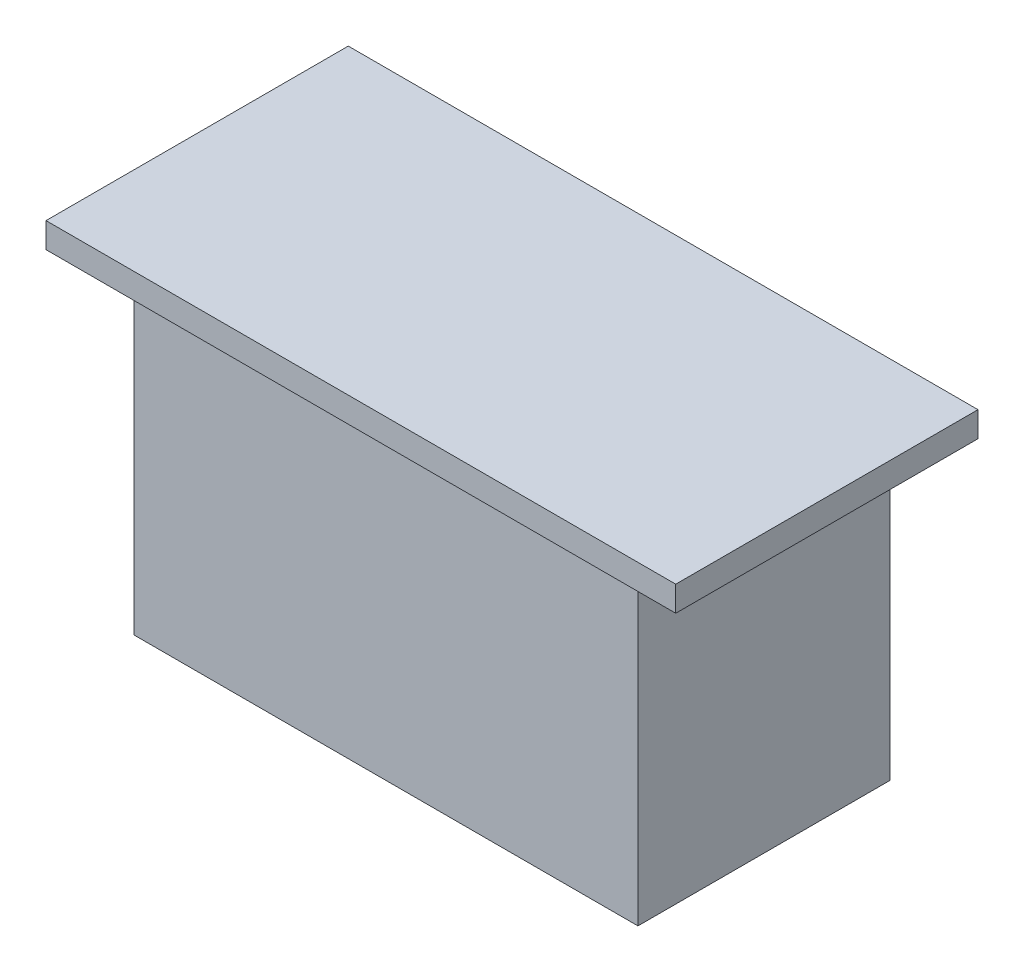
ISO-10303-21;
HEADER;
FILE_DESCRIPTION(('STEP AP214'),'2;1');
FILE_NAME('part.step','',(''),(''),'','','');
FILE_SCHEMA(('AUTOMOTIVE_DESIGN { 1 0 10303 214 1 1 1 1 }'));
ENDSEC;
DATA;
#1=APPLICATION_CONTEXT('core data for automotive mechanical design processes');
#2=APPLICATION_PROTOCOL_DEFINITION('international standard','automotive_design',2000,#1);
#3=PRODUCT_CONTEXT('',#1,'mechanical');
#4=PRODUCT('Part','Part','',(#3));
#5=PRODUCT_RELATED_PRODUCT_CATEGORY('part','',(#4));
#6=PRODUCT_DEFINITION_FORMATION('','',#4);
#7=PRODUCT_DEFINITION_CONTEXT('part definition',#1,'design');
#8=PRODUCT_DEFINITION('design','',#6,#7);
#9=PRODUCT_DEFINITION_SHAPE('','',#8);
#10=(LENGTH_UNIT() NAMED_UNIT(*) SI_UNIT(.MILLI.,.METRE.));
#11=(NAMED_UNIT(*) PLANE_ANGLE_UNIT() SI_UNIT($,.RADIAN.));
#12=(NAMED_UNIT(*) SI_UNIT($,.STERADIAN.) SOLID_ANGLE_UNIT());
#13=UNCERTAINTY_MEASURE_WITH_UNIT(LENGTH_MEASURE(1.E-05),#10,'distance_accuracy_value','');
#14=(GEOMETRIC_REPRESENTATION_CONTEXT(3) GLOBAL_UNCERTAINTY_ASSIGNED_CONTEXT((#13)) GLOBAL_UNIT_ASSIGNED_CONTEXT((#10,
#11,#12)) REPRESENTATION_CONTEXT('',''));
#15=CARTESIAN_POINT('',(0.,0.,0.));
#16=DIRECTION('',(0.,0.,1.));
#17=DIRECTION('',(1.,0.,0.));
#18=AXIS2_PLACEMENT_3D('',#15,#16,#17);
#19=CARTESIAN_POINT('',(-9.81854133457408,15.875,-5.98265060114626));
#20=DIRECTION('',(0.,0.,-1.));
#21=DIRECTION('',(-1.,0.,0.));
#22=AXIS2_PLACEMENT_3D('',#19,#20,#21);
#23=PLANE('',#22);
#24=DIRECTION('',(1.,0.,0.));
#25=VECTOR('',#24,1.);
#26=CARTESIAN_POINT('',(-9.81854133457408,0.,-5.98265060114626));
#27=LINE('',#26,#25);
#28=CARTESIAN_POINT('',(-9.81854133457408,0.,-5.98265060114626));
#29=VERTEX_POINT('',#28);
#30=CARTESIAN_POINT('',(15.5814586654259,0.,-5.98265060114626));
#31=VERTEX_POINT('',#30);
#32=EDGE_CURVE('E89',#29,#31,#27,.T.);
#33=ORIENTED_EDGE('',*,*,#32,.F.);
#34=DIRECTION('',(0.,-1.,0.));
#35=VECTOR('',#34,1.);
#36=CARTESIAN_POINT('',(-9.81854133457408,15.875,-5.98265060114626));
#37=LINE('',#36,#35);
#38=CARTESIAN_POINT('',(-9.81854133457408,15.875,-5.98265060114626));
#39=VERTEX_POINT('',#38);
#40=EDGE_CURVE('E11',#39,#29,#37,.T.);
#41=ORIENTED_EDGE('',*,*,#40,.F.);
#42=DIRECTION('',(1.,0.,0.));
#43=VECTOR('',#42,1.);
#44=CARTESIAN_POINT('',(-9.81854133457408,15.875,-5.98265060114626));
#45=LINE('',#44,#43);
#46=CARTESIAN_POINT('',(15.5814586654259,15.875,-5.98265060114626));
#47=VERTEX_POINT('',#46);
#48=EDGE_CURVE('E76',#39,#47,#45,.T.);
#49=ORIENTED_EDGE('',*,*,#48,.T.);
#50=DIRECTION('',(0.,-1.,0.));
#51=VECTOR('',#50,1.);
#52=CARTESIAN_POINT('',(15.5814586654259,15.875,-5.98265060114626));
#53=LINE('',#52,#51);
#54=EDGE_CURVE('E36',#47,#31,#53,.T.);
#55=ORIENTED_EDGE('',*,*,#54,.T.);
#56=EDGE_LOOP('',(#33,#41,#49,#55));
#57=FACE_BOUND('',#56,.T.);
#58=ADVANCED_FACE('F33',(#57),#23,.T.);
#59=CARTESIAN_POINT('',(-9.81854133457408,15.875,-5.98265060114626));
#60=DIRECTION('',(1.,0.,0.));
#61=DIRECTION('',(0.,0.,-1.));
#62=AXIS2_PLACEMENT_3D('',#59,#60,#61);
#63=PLANE('',#62);
#64=DIRECTION('',(0.,0.,1.));
#65=VECTOR('',#64,1.);
#66=CARTESIAN_POINT('',(-9.81854133457408,0.,-5.98265060114626));
#67=LINE('',#66,#65);
#68=CARTESIAN_POINT('',(-9.81854133457408,0.,6.71734939885374));
#69=VERTEX_POINT('',#68);
#70=EDGE_CURVE('E66',#29,#69,#67,.T.);
#71=ORIENTED_EDGE('',*,*,#70,.T.);
#72=DIRECTION('',(0.,-1.,0.));
#73=VECTOR('',#72,1.);
#74=CARTESIAN_POINT('',(-9.81854133457408,15.875,6.71734939885374));
#75=LINE('',#74,#73);
#76=CARTESIAN_POINT('',(-9.81854133457408,15.875,6.71734939885374));
#77=VERTEX_POINT('',#76);
#78=EDGE_CURVE('E42',#77,#69,#75,.T.);
#79=ORIENTED_EDGE('',*,*,#78,.F.);
#80=DIRECTION('',(0.,0.,1.));
#81=VECTOR('',#80,1.);
#82=CARTESIAN_POINT('',(-9.81854133457408,15.875,-5.98265060114626));
#83=LINE('',#82,#81);
#84=EDGE_CURVE('E94',#39,#77,#83,.T.);
#85=ORIENTED_EDGE('',*,*,#84,.F.);
#86=ORIENTED_EDGE('',*,*,#40,.T.);
#87=EDGE_LOOP('',(#71,#79,#85,#86));
#88=FACE_BOUND('',#87,.T.);
#89=ADVANCED_FACE('F68',(#88),#63,.F.);
#90=CARTESIAN_POINT('',(-9.81854133457408,15.875,6.71734939885374));
#91=DIRECTION('',(0.,0.,-1.));
#92=DIRECTION('',(-1.,0.,0.));
#93=AXIS2_PLACEMENT_3D('',#90,#91,#92);
#94=PLANE('',#93);
#95=DIRECTION('',(1.,0.,0.));
#96=VECTOR('',#95,1.);
#97=CARTESIAN_POINT('',(-9.81854133457408,0.,6.71734939885374));
#98=LINE('',#97,#96);
#99=CARTESIAN_POINT('',(15.5814586654259,0.,6.71734939885374));
#100=VERTEX_POINT('',#99);
#101=EDGE_CURVE('E77',#69,#100,#98,.T.);
#102=ORIENTED_EDGE('',*,*,#101,.T.);
#103=DIRECTION('',(0.,-1.,0.));
#104=VECTOR('',#103,1.);
#105=CARTESIAN_POINT('',(15.5814586654259,15.875,6.71734939885374));
#106=LINE('',#105,#104);
#107=CARTESIAN_POINT('',(15.5814586654259,15.875,6.71734939885374));
#108=VERTEX_POINT('',#107);
#109=EDGE_CURVE('E83',#108,#100,#106,.T.);
#110=ORIENTED_EDGE('',*,*,#109,.F.);
#111=DIRECTION('',(1.,0.,0.));
#112=VECTOR('',#111,1.);
#113=CARTESIAN_POINT('',(-9.81854133457408,15.875,6.71734939885374));
#114=LINE('',#113,#112);
#115=EDGE_CURVE('E50',#77,#108,#114,.T.);
#116=ORIENTED_EDGE('',*,*,#115,.F.);
#117=ORIENTED_EDGE('',*,*,#78,.T.);
#118=EDGE_LOOP('',(#102,#110,#116,#117));
#119=FACE_BOUND('',#118,.T.);
#120=ADVANCED_FACE('F81',(#119),#94,.F.);
#121=CARTESIAN_POINT('',(15.5814586654259,15.875,-5.98265060114626));
#122=DIRECTION('',(1.,0.,0.));
#123=DIRECTION('',(0.,0.,-1.));
#124=AXIS2_PLACEMENT_3D('',#121,#122,#123);
#125=PLANE('',#124);
#126=DIRECTION('',(0.,0.,1.));
#127=VECTOR('',#126,1.);
#128=CARTESIAN_POINT('',(15.5814586654259,0.,-5.98265060114626));
#129=LINE('',#128,#127);
#130=EDGE_CURVE('E87',#31,#100,#129,.T.);
#131=ORIENTED_EDGE('',*,*,#130,.F.);
#132=ORIENTED_EDGE('',*,*,#54,.F.);
#133=DIRECTION('',(0.,0.,1.));
#134=VECTOR('',#133,1.);
#135=CARTESIAN_POINT('',(15.5814586654259,15.875,-5.98265060114626));
#136=LINE('',#135,#134);
#137=EDGE_CURVE('E100',#47,#108,#136,.T.);
#138=ORIENTED_EDGE('',*,*,#137,.T.);
#139=ORIENTED_EDGE('',*,*,#109,.T.);
#140=EDGE_LOOP('',(#131,#132,#138,#139));
#141=FACE_BOUND('',#140,.T.);
#142=ADVANCED_FACE('F118',(#141),#125,.T.);
#143=CARTESIAN_POINT('',(0.,0.,0.));
#144=DIRECTION('',(0.,-1.,0.));
#145=DIRECTION('',(0.,0.,-1.));
#146=AXIS2_PLACEMENT_3D('',#143,#144,#145);
#147=PLANE('',#146);
#148=ORIENTED_EDGE('',*,*,#32,.T.);
#149=ORIENTED_EDGE('',*,*,#130,.T.);
#150=ORIENTED_EDGE('',*,*,#101,.F.);
#151=ORIENTED_EDGE('',*,*,#70,.F.);
#152=EDGE_LOOP('',(#148,#149,#150,#151));
#153=FACE_BOUND('',#152,.T.);
#154=ADVANCED_FACE('F85',(#153),#147,.T.);
#155=CARTESIAN_POINT('',(-12.9935413345741,17.145,7.98734939885374));
#156=DIRECTION('',(1.,0.,0.));
#157=DIRECTION('',(0.,0.,-1.));
#158=AXIS2_PLACEMENT_3D('',#155,#156,#157);
#159=PLANE('',#158);
#160=DIRECTION('',(0.,0.,1.));
#161=VECTOR('',#160,1.);
#162=CARTESIAN_POINT('',(-12.9935413345741,15.875,7.98734939885374));
#163=LINE('',#162,#161);
#164=CARTESIAN_POINT('',(-12.9935413345741,15.875,-7.25265060114625));
#165=VERTEX_POINT('',#164);
#166=CARTESIAN_POINT('',(-12.9935413345741,15.875,7.98734939885374));
#167=VERTEX_POINT('',#166);
#168=EDGE_CURVE('E164',#165,#167,#163,.T.);
#169=ORIENTED_EDGE('',*,*,#168,.T.);
#170=DIRECTION('',(0.,-1.,0.));
#171=VECTOR('',#170,1.);
#172=CARTESIAN_POINT('',(-12.9935413345741,17.145,7.98734939885374));
#173=LINE('',#172,#171);
#174=CARTESIAN_POINT('',(-12.9935413345741,17.145,7.98734939885374));
#175=VERTEX_POINT('',#174);
#176=EDGE_CURVE('E103',#175,#167,#173,.T.);
#177=ORIENTED_EDGE('',*,*,#176,.F.);
#178=DIRECTION('',(0.,0.,1.));
#179=VECTOR('',#178,1.);
#180=CARTESIAN_POINT('',(-12.9935413345741,17.145,7.98734939885374));
#181=LINE('',#180,#179);
#182=CARTESIAN_POINT('',(-12.9935413345741,17.145,-7.25265060114625));
#183=VERTEX_POINT('',#182);
#184=EDGE_CURVE('E151',#183,#175,#181,.T.);
#185=ORIENTED_EDGE('',*,*,#184,.F.);
#186=DIRECTION('',(0.,-1.,0.));
#187=VECTOR('',#186,1.);
#188=CARTESIAN_POINT('',(-12.9935413345741,17.145,-7.25265060114625));
#189=LINE('',#188,#187);
#190=EDGE_CURVE('E165',#183,#165,#189,.T.);
#191=ORIENTED_EDGE('',*,*,#190,.T.);
#192=EDGE_LOOP('',(#169,#177,#185,#191));
#193=FACE_BOUND('',#192,.T.);
#194=ADVANCED_FACE('F162',(#193),#159,.F.);
#195=CARTESIAN_POINT('',(-12.9935413345741,17.145,7.98734939885374));
#196=DIRECTION('',(0.,0.,-1.));
#197=DIRECTION('',(-1.,0.,0.));
#198=AXIS2_PLACEMENT_3D('',#195,#196,#197);
#199=PLANE('',#198);
#200=DIRECTION('',(1.,0.,0.));
#201=VECTOR('',#200,1.);
#202=CARTESIAN_POINT('',(-12.9935413345741,15.875,7.98734939885374));
#203=LINE('',#202,#201);
#204=CARTESIAN_POINT('',(18.7564586654259,15.875,7.98734939885374));
#205=VERTEX_POINT('',#204);
#206=EDGE_CURVE('E167',#167,#205,#203,.T.);
#207=ORIENTED_EDGE('',*,*,#206,.T.);
#208=DIRECTION('',(0.,-1.,0.));
#209=VECTOR('',#208,1.);
#210=CARTESIAN_POINT('',(18.7564586654259,17.145,7.98734939885374));
#211=LINE('',#210,#209);
#212=CARTESIAN_POINT('',(18.7564586654259,17.145,7.98734939885374));
#213=VERTEX_POINT('',#212);
#214=EDGE_CURVE('E105',#213,#205,#211,.T.);
#215=ORIENTED_EDGE('',*,*,#214,.F.);
#216=DIRECTION('',(1.,0.,0.));
#217=VECTOR('',#216,1.);
#218=CARTESIAN_POINT('',(-12.9935413345741,17.145,7.98734939885374));
#219=LINE('',#218,#217);
#220=EDGE_CURVE('E145',#175,#213,#219,.T.);
#221=ORIENTED_EDGE('',*,*,#220,.F.);
#222=ORIENTED_EDGE('',*,*,#176,.T.);
#223=EDGE_LOOP('',(#207,#215,#221,#222));
#224=FACE_BOUND('',#223,.T.);
#225=ADVANCED_FACE('F147',(#224),#199,.F.);
#226=CARTESIAN_POINT('',(18.7564586654259,17.145,7.98734939885374));
#227=DIRECTION('',(-1.,0.,0.));
#228=DIRECTION('',(0.,0.,1.));
#229=AXIS2_PLACEMENT_3D('',#226,#227,#228);
#230=PLANE('',#229);
#231=DIRECTION('',(0.,0.,-1.));
#232=VECTOR('',#231,1.);
#233=CARTESIAN_POINT('',(18.7564586654259,15.875,7.98734939885374));
#234=LINE('',#233,#232);
#235=CARTESIAN_POINT('',(18.7564586654259,15.875,-7.25265060114626));
#236=VERTEX_POINT('',#235);
#237=EDGE_CURVE('E169',#205,#236,#234,.T.);
#238=ORIENTED_EDGE('',*,*,#237,.T.);
#239=DIRECTION('',(0.,-1.,0.));
#240=VECTOR('',#239,1.);
#241=CARTESIAN_POINT('',(18.7564586654259,17.145,-7.25265060114626));
#242=LINE('',#241,#240);
#243=CARTESIAN_POINT('',(18.7564586654259,17.145,-7.25265060114626));
#244=VERTEX_POINT('',#243);
#245=EDGE_CURVE('E114',#244,#236,#242,.T.);
#246=ORIENTED_EDGE('',*,*,#245,.F.);
#247=DIRECTION('',(0.,0.,-1.));
#248=VECTOR('',#247,1.);
#249=CARTESIAN_POINT('',(18.7564586654259,17.145,7.98734939885374));
#250=LINE('',#249,#248);
#251=EDGE_CURVE('E150',#213,#244,#250,.T.);
#252=ORIENTED_EDGE('',*,*,#251,.F.);
#253=ORIENTED_EDGE('',*,*,#214,.T.);
#254=EDGE_LOOP('',(#238,#246,#252,#253));
#255=FACE_BOUND('',#254,.T.);
#256=ADVANCED_FACE('F182',(#255),#230,.F.);
#257=CARTESIAN_POINT('',(-12.9935413345741,17.145,-7.25265060114625));
#258=DIRECTION('',(0.,0.,1.));
#259=DIRECTION('',(1.,0.,0.));
#260=AXIS2_PLACEMENT_3D('',#257,#258,#259);
#261=PLANE('',#260);
#262=DIRECTION('',(-1.,0.,0.));
#263=VECTOR('',#262,1.);
#264=CARTESIAN_POINT('',(-12.9935413345741,15.875,-7.25265060114625));
#265=LINE('',#264,#263);
#266=EDGE_CURVE('E160',#236,#165,#265,.T.);
#267=ORIENTED_EDGE('',*,*,#266,.T.);
#268=ORIENTED_EDGE('',*,*,#190,.F.);
#269=DIRECTION('',(-1.,0.,0.));
#270=VECTOR('',#269,1.);
#271=CARTESIAN_POINT('',(-12.9935413345741,17.145,-7.25265060114625));
#272=LINE('',#271,#270);
#273=EDGE_CURVE('E156',#244,#183,#272,.T.);
#274=ORIENTED_EDGE('',*,*,#273,.F.);
#275=ORIENTED_EDGE('',*,*,#245,.T.);
#276=EDGE_LOOP('',(#267,#268,#274,#275));
#277=FACE_BOUND('',#276,.T.);
#278=ADVANCED_FACE('F179',(#277),#261,.F.);
#279=CARTESIAN_POINT('',(0.,17.145,0.));
#280=DIRECTION('',(0.,-1.,0.));
#281=DIRECTION('',(0.,0.,-1.));
#282=AXIS2_PLACEMENT_3D('',#279,#280,#281);
#283=PLANE('',#282);
#284=ORIENTED_EDGE('',*,*,#184,.T.);
#285=ORIENTED_EDGE('',*,*,#220,.T.);
#286=ORIENTED_EDGE('',*,*,#251,.T.);
#287=ORIENTED_EDGE('',*,*,#273,.T.);
#288=EDGE_LOOP('',(#284,#285,#286,#287));
#289=FACE_BOUND('',#288,.T.);
#290=ADVANCED_FACE('F154',(#289),#283,.F.);
#291=CARTESIAN_POINT('',(0.,15.875,0.));
#292=DIRECTION('',(0.,-1.,0.));
#293=DIRECTION('',(0.,0.,-1.));
#294=AXIS2_PLACEMENT_3D('',#291,#292,#293);
#295=PLANE('',#294);
#296=ORIENTED_EDGE('',*,*,#137,.F.);
#297=ORIENTED_EDGE('',*,*,#48,.F.);
#298=ORIENTED_EDGE('',*,*,#84,.T.);
#299=ORIENTED_EDGE('',*,*,#115,.T.);
#300=EDGE_LOOP('',(#296,#297,#298,#299));
#301=FACE_BOUND('',#300,.T.);
#302=ORIENTED_EDGE('',*,*,#168,.F.);
#303=ORIENTED_EDGE('',*,*,#266,.F.);
#304=ORIENTED_EDGE('',*,*,#237,.F.);
#305=ORIENTED_EDGE('',*,*,#206,.F.);
#306=EDGE_LOOP('',(#302,#303,#304,#305));
#307=FACE_BOUND('',#306,.T.);
#308=ADVANCED_FACE('F120',(#301,#307),#295,.T.);
#309=CLOSED_SHELL('',(#58,#89,#120,#142,#154,#194,#225,#256,#278,#290,#308));
#310=MANIFOLD_SOLID_BREP('B2',#309);
#311=ADVANCED_BREP_SHAPE_REPRESENTATION('',(#18,#310),#14);
#312=SHAPE_DEFINITION_REPRESENTATION(#9,#311);
ENDSEC;
END-ISO-10303-21;
